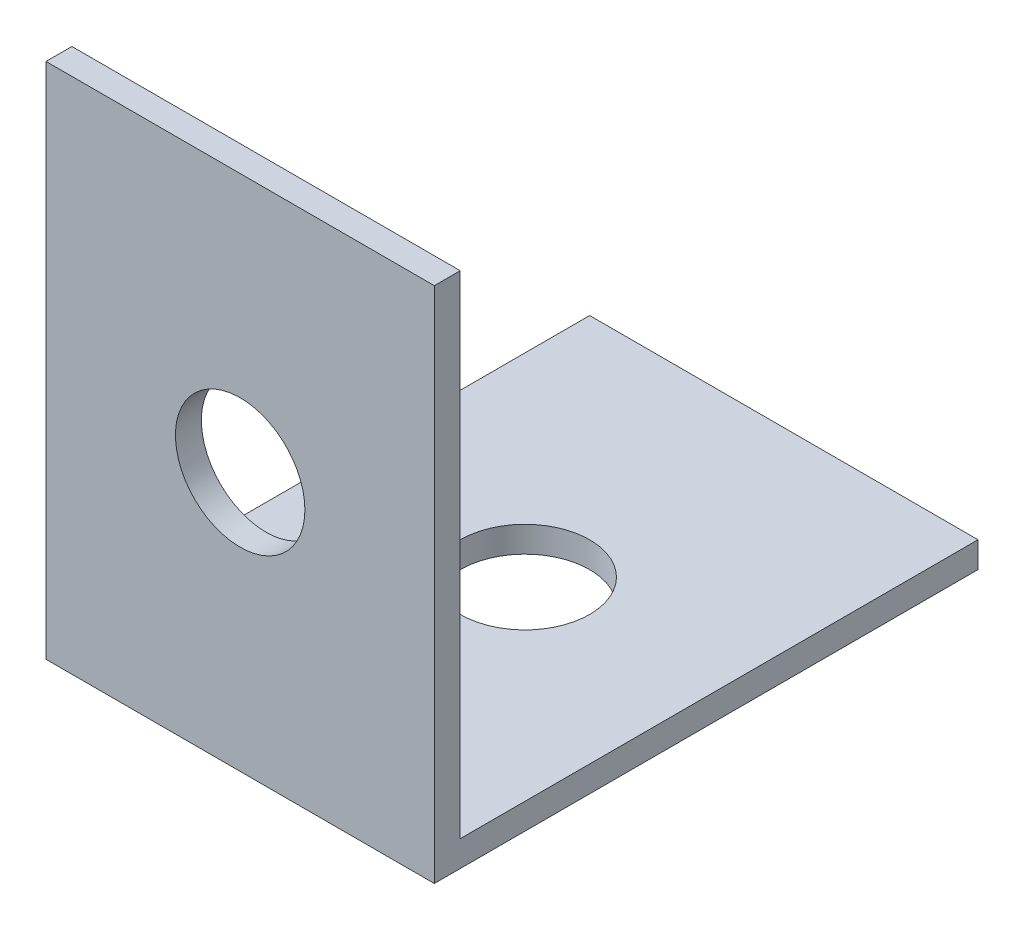
ISO-10303-21;
HEADER;
FILE_DESCRIPTION(('STEP AP214'),'2;1');
FILE_NAME('part.step','',(''),(''),'','','');
FILE_SCHEMA(('AUTOMOTIVE_DESIGN { 1 0 10303 214 1 1 1 1 }'));
ENDSEC;
DATA;
#1=APPLICATION_CONTEXT('core data for automotive mechanical design processes');
#2=APPLICATION_PROTOCOL_DEFINITION('international standard','automotive_design',2000,#1);
#3=PRODUCT_CONTEXT('',#1,'mechanical');
#4=PRODUCT('Part','Part','',(#3));
#5=PRODUCT_RELATED_PRODUCT_CATEGORY('part','',(#4));
#6=PRODUCT_DEFINITION_FORMATION('','',#4);
#7=PRODUCT_DEFINITION_CONTEXT('part definition',#1,'design');
#8=PRODUCT_DEFINITION('design','',#6,#7);
#9=PRODUCT_DEFINITION_SHAPE('','',#8);
#10=(LENGTH_UNIT() NAMED_UNIT(*) SI_UNIT(.MILLI.,.METRE.));
#11=(NAMED_UNIT(*) PLANE_ANGLE_UNIT() SI_UNIT($,.RADIAN.));
#12=(NAMED_UNIT(*) SI_UNIT($,.STERADIAN.) SOLID_ANGLE_UNIT());
#13=UNCERTAINTY_MEASURE_WITH_UNIT(LENGTH_MEASURE(1.E-05),#10,'distance_accuracy_value','');
#14=(GEOMETRIC_REPRESENTATION_CONTEXT(3) GLOBAL_UNCERTAINTY_ASSIGNED_CONTEXT((#13)) GLOBAL_UNIT_ASSIGNED_CONTEXT((#10,
#11,#12)) REPRESENTATION_CONTEXT('',''));
#15=CARTESIAN_POINT('',(0.,0.,0.));
#16=DIRECTION('',(0.,0.,1.));
#17=DIRECTION('',(1.,0.,0.));
#18=AXIS2_PLACEMENT_3D('',#15,#16,#17);
#19=CARTESIAN_POINT('',(0.,1.,0.));
#20=DIRECTION('',(0.,-1.,0.));
#21=DIRECTION('',(0.,0.,-1.));
#22=AXIS2_PLACEMENT_3D('',#19,#20,#21);
#23=PLANE('',#22);
#24=DIRECTION('',(0.,0.,-1.));
#25=VECTOR('',#24,1.);
#26=CARTESIAN_POINT('',(7.5,1.,10.));
#27=LINE('',#26,#25);
#28=CARTESIAN_POINT('',(7.5,1.,10.));
#29=VERTEX_POINT('',#28);
#30=CARTESIAN_POINT('',(7.5,1.,-10.));
#31=VERTEX_POINT('',#30);
#32=EDGE_CURVE('E88',#29,#31,#27,.T.);
#33=ORIENTED_EDGE('',*,*,#32,.T.);
#34=DIRECTION('',(-1.,0.,0.));
#35=VECTOR('',#34,1.);
#36=CARTESIAN_POINT('',(-7.5,1.,-10.));
#37=LINE('',#36,#35);
#38=CARTESIAN_POINT('',(-7.5,1.,-10.));
#39=VERTEX_POINT('',#38);
#40=EDGE_CURVE('E78',#31,#39,#37,.T.);
#41=ORIENTED_EDGE('',*,*,#40,.T.);
#42=DIRECTION('',(0.,0.,1.));
#43=VECTOR('',#42,1.);
#44=CARTESIAN_POINT('',(-7.5,1.,10.));
#45=LINE('',#44,#43);
#46=CARTESIAN_POINT('',(-7.5,1.,10.));
#47=VERTEX_POINT('',#46);
#48=EDGE_CURVE('E87',#39,#47,#45,.T.);
#49=ORIENTED_EDGE('',*,*,#48,.T.);
#50=DIRECTION('',(1.,0.,0.));
#51=VECTOR('',#50,1.);
#52=CARTESIAN_POINT('',(-7.5,1.,10.));
#53=LINE('',#52,#51);
#54=EDGE_CURVE('E67',#47,#29,#53,.T.);
#55=ORIENTED_EDGE('',*,*,#54,.T.);
#56=EDGE_LOOP('',(#33,#41,#49,#55));
#57=FACE_BOUND('',#56,.T.);
#58=CARTESIAN_POINT('',(0.,1.,0.));
#59=DIRECTION('',(0.,1.,0.));
#60=DIRECTION('',(0.,0.,1.));
#61=AXIS2_PLACEMENT_3D('',#58,#59,#60);
#62=CIRCLE('',#61,2.5);
#63=CARTESIAN_POINT('',(0.,1.,2.5));
#64=VERTEX_POINT('',#63);
#65=EDGE_CURVE('E103',#64,#64,#62,.T.);
#66=ORIENTED_EDGE('',*,*,#65,.F.);
#67=EDGE_LOOP('',(#66));
#68=FACE_BOUND('',#67,.T.);
#69=ADVANCED_FACE('F33',(#57,#68),#23,.F.);
#70=CARTESIAN_POINT('',(0.,0.,0.));
#71=DIRECTION('',(0.,-1.,0.));
#72=DIRECTION('',(0.,0.,-1.));
#73=AXIS2_PLACEMENT_3D('',#70,#71,#72);
#74=PLANE('',#73);
#75=DIRECTION('',(0.,0.,-1.));
#76=VECTOR('',#75,1.);
#77=CARTESIAN_POINT('',(7.5,0.,10.));
#78=LINE('',#77,#76);
#79=CARTESIAN_POINT('',(7.5,0.,11.));
#80=VERTEX_POINT('',#79);
#81=CARTESIAN_POINT('',(7.5,0.,-10.));
#82=VERTEX_POINT('',#81);
#83=EDGE_CURVE('E96',#80,#82,#78,.T.);
#84=ORIENTED_EDGE('',*,*,#83,.F.);
#85=DIRECTION('',(1.,0.,0.));
#86=VECTOR('',#85,1.);
#87=CARTESIAN_POINT('',(-7.5,0.,11.));
#88=LINE('',#87,#86);
#89=CARTESIAN_POINT('',(-7.5,0.,11.));
#90=VERTEX_POINT('',#89);
#91=EDGE_CURVE('E134',#90,#80,#88,.T.);
#92=ORIENTED_EDGE('',*,*,#91,.F.);
#93=DIRECTION('',(0.,0.,1.));
#94=VECTOR('',#93,1.);
#95=CARTESIAN_POINT('',(-7.5,0.,10.));
#96=LINE('',#95,#94);
#97=CARTESIAN_POINT('',(-7.5,0.,-10.));
#98=VERTEX_POINT('',#97);
#99=EDGE_CURVE('E93',#98,#90,#96,.T.);
#100=ORIENTED_EDGE('',*,*,#99,.F.);
#101=DIRECTION('',(-1.,0.,0.));
#102=VECTOR('',#101,1.);
#103=CARTESIAN_POINT('',(-7.5,0.,-10.));
#104=LINE('',#103,#102);
#105=EDGE_CURVE('E63',#82,#98,#104,.T.);
#106=ORIENTED_EDGE('',*,*,#105,.F.);
#107=EDGE_LOOP('',(#84,#92,#100,#106));
#108=FACE_BOUND('',#107,.T.);
#109=CARTESIAN_POINT('',(0.,0.,0.));
#110=DIRECTION('',(0.,1.,0.));
#111=DIRECTION('',(0.,0.,1.));
#112=AXIS2_PLACEMENT_3D('',#109,#110,#111);
#113=CIRCLE('',#112,2.5);
#114=CARTESIAN_POINT('',(0.,0.,2.5));
#115=VERTEX_POINT('',#114);
#116=EDGE_CURVE('E107',#115,#115,#113,.T.);
#117=ORIENTED_EDGE('',*,*,#116,.T.);
#118=EDGE_LOOP('',(#117));
#119=FACE_BOUND('',#118,.T.);
#120=ADVANCED_FACE('F164',(#108,#119),#74,.T.);
#121=CARTESIAN_POINT('',(7.5,1.,10.));
#122=DIRECTION('',(-1.,0.,0.));
#123=DIRECTION('',(0.,0.,1.));
#124=AXIS2_PLACEMENT_3D('',#121,#122,#123);
#125=PLANE('',#124);
#126=ORIENTED_EDGE('',*,*,#83,.T.);
#127=DIRECTION('',(0.,-1.,0.));
#128=VECTOR('',#127,1.);
#129=CARTESIAN_POINT('',(7.5,1.,-10.));
#130=LINE('',#129,#128);
#131=EDGE_CURVE('E11',#31,#82,#130,.T.);
#132=ORIENTED_EDGE('',*,*,#131,.F.);
#133=ORIENTED_EDGE('',*,*,#32,.F.);
#134=DIRECTION('',(0.,1.,0.));
#135=VECTOR('',#134,1.);
#136=CARTESIAN_POINT('',(7.5,0.,10.));
#137=LINE('',#136,#135);
#138=CARTESIAN_POINT('',(7.5,20.,10.));
#139=VERTEX_POINT('',#138);
#140=EDGE_CURVE('E50',#29,#139,#137,.T.);
#141=ORIENTED_EDGE('',*,*,#140,.T.);
#142=DIRECTION('',(0.,0.,-1.));
#143=VECTOR('',#142,1.);
#144=CARTESIAN_POINT('',(7.5,20.,11.));
#145=LINE('',#144,#143);
#146=CARTESIAN_POINT('',(7.5,20.,11.));
#147=VERTEX_POINT('',#146);
#148=EDGE_CURVE('E116',#147,#139,#145,.T.);
#149=ORIENTED_EDGE('',*,*,#148,.F.);
#150=DIRECTION('',(0.,1.,0.));
#151=VECTOR('',#150,1.);
#152=CARTESIAN_POINT('',(7.5,0.,11.));
#153=LINE('',#152,#151);
#154=EDGE_CURVE('E100',#80,#147,#153,.T.);
#155=ORIENTED_EDGE('',*,*,#154,.F.);
#156=EDGE_LOOP('',(#126,#132,#133,#141,#149,#155));
#157=FACE_BOUND('',#156,.T.);
#158=ADVANCED_FACE('F35',(#157),#125,.F.);
#159=CARTESIAN_POINT('',(-7.5,1.,-10.));
#160=DIRECTION('',(0.,0.,1.));
#161=DIRECTION('',(1.,0.,0.));
#162=AXIS2_PLACEMENT_3D('',#159,#160,#161);
#163=PLANE('',#162);
#164=ORIENTED_EDGE('',*,*,#105,.T.);
#165=DIRECTION('',(0.,-1.,0.));
#166=VECTOR('',#165,1.);
#167=CARTESIAN_POINT('',(-7.5,1.,-10.));
#168=LINE('',#167,#166);
#169=EDGE_CURVE('E42',#39,#98,#168,.T.);
#170=ORIENTED_EDGE('',*,*,#169,.F.);
#171=ORIENTED_EDGE('',*,*,#40,.F.);
#172=ORIENTED_EDGE('',*,*,#131,.T.);
#173=EDGE_LOOP('',(#164,#170,#171,#172));
#174=FACE_BOUND('',#173,.T.);
#175=ADVANCED_FACE('F80',(#174),#163,.F.);
#176=CARTESIAN_POINT('',(-7.5,1.,10.));
#177=DIRECTION('',(1.,0.,0.));
#178=DIRECTION('',(0.,0.,-1.));
#179=AXIS2_PLACEMENT_3D('',#176,#177,#178);
#180=PLANE('',#179);
#181=ORIENTED_EDGE('',*,*,#99,.T.);
#182=DIRECTION('',(0.,-1.,0.));
#183=VECTOR('',#182,1.);
#184=CARTESIAN_POINT('',(-7.5,0.,11.));
#185=LINE('',#184,#183);
#186=CARTESIAN_POINT('',(-7.5,20.,11.));
#187=VERTEX_POINT('',#186);
#188=EDGE_CURVE('E127',#187,#90,#185,.T.);
#189=ORIENTED_EDGE('',*,*,#188,.F.);
#190=DIRECTION('',(0.,0.,-1.));
#191=VECTOR('',#190,1.);
#192=CARTESIAN_POINT('',(-7.5,20.,11.));
#193=LINE('',#192,#191);
#194=CARTESIAN_POINT('',(-7.5,20.,10.));
#195=VERTEX_POINT('',#194);
#196=EDGE_CURVE('E120',#187,#195,#193,.T.);
#197=ORIENTED_EDGE('',*,*,#196,.T.);
#198=DIRECTION('',(0.,-1.,0.));
#199=VECTOR('',#198,1.);
#200=CARTESIAN_POINT('',(-7.5,0.,10.));
#201=LINE('',#200,#199);
#202=EDGE_CURVE('E129',#195,#47,#201,.T.);
#203=ORIENTED_EDGE('',*,*,#202,.T.);
#204=ORIENTED_EDGE('',*,*,#48,.F.);
#205=ORIENTED_EDGE('',*,*,#169,.T.);
#206=EDGE_LOOP('',(#181,#189,#197,#203,#204,#205));
#207=FACE_BOUND('',#206,.T.);
#208=ADVANCED_FACE('F172',(#207),#180,.F.);
#209=CARTESIAN_POINT('',(0.,1.,0.));
#210=DIRECTION('',(0.,-1.,0.));
#211=DIRECTION('',(0.,0.,-1.));
#212=AXIS2_PLACEMENT_3D('',#209,#210,#211);
#213=CYLINDRICAL_SURFACE('',#212,2.5);
#214=ORIENTED_EDGE('',*,*,#65,.T.);
#215=EDGE_LOOP('',(#214));
#216=FACE_BOUND('',#215,.T.);
#217=ORIENTED_EDGE('',*,*,#116,.F.);
#218=EDGE_LOOP('',(#217));
#219=FACE_BOUND('',#218,.T.);
#220=ADVANCED_FACE('F159',(#216,#219),#213,.F.);
#221=CARTESIAN_POINT('',(0.,0.,10.));
#222=DIRECTION('',(0.,0.,-1.));
#223=DIRECTION('',(-1.,0.,0.));
#224=AXIS2_PLACEMENT_3D('',#221,#222,#223);
#225=PLANE('',#224);
#226=CARTESIAN_POINT('',(0.,10.,10.));
#227=DIRECTION('',(0.,0.,1.));
#228=DIRECTION('',(1.,0.,0.));
#229=AXIS2_PLACEMENT_3D('',#226,#227,#228);
#230=CIRCLE('',#229,2.5);
#231=CARTESIAN_POINT('',(2.5,10.,10.));
#232=VERTEX_POINT('',#231);
#233=EDGE_CURVE('E138',#232,#232,#230,.T.);
#234=ORIENTED_EDGE('',*,*,#233,.T.);
#235=EDGE_LOOP('',(#234));
#236=FACE_BOUND('',#235,.T.);
#237=ORIENTED_EDGE('',*,*,#54,.F.);
#238=ORIENTED_EDGE('',*,*,#202,.F.);
#239=DIRECTION('',(-1.,0.,0.));
#240=VECTOR('',#239,1.);
#241=CARTESIAN_POINT('',(-7.5,20.,10.));
#242=LINE('',#241,#240);
#243=EDGE_CURVE('E124',#139,#195,#242,.T.);
#244=ORIENTED_EDGE('',*,*,#243,.F.);
#245=ORIENTED_EDGE('',*,*,#140,.F.);
#246=EDGE_LOOP('',(#237,#238,#244,#245));
#247=FACE_BOUND('',#246,.T.);
#248=ADVANCED_FACE('F150',(#236,#247),#225,.T.);
#249=CARTESIAN_POINT('',(0.,0.,11.));
#250=DIRECTION('',(0.,0.,-1.));
#251=DIRECTION('',(-1.,0.,0.));
#252=AXIS2_PLACEMENT_3D('',#249,#250,#251);
#253=PLANE('',#252);
#254=ORIENTED_EDGE('',*,*,#188,.T.);
#255=ORIENTED_EDGE('',*,*,#91,.T.);
#256=ORIENTED_EDGE('',*,*,#154,.T.);
#257=DIRECTION('',(-1.,0.,0.));
#258=VECTOR('',#257,1.);
#259=CARTESIAN_POINT('',(-7.5,20.,11.));
#260=LINE('',#259,#258);
#261=EDGE_CURVE('E123',#147,#187,#260,.T.);
#262=ORIENTED_EDGE('',*,*,#261,.T.);
#263=EDGE_LOOP('',(#254,#255,#256,#262));
#264=FACE_BOUND('',#263,.T.);
#265=CARTESIAN_POINT('',(0.,10.,11.));
#266=DIRECTION('',(0.,0.,1.));
#267=DIRECTION('',(1.,0.,0.));
#268=AXIS2_PLACEMENT_3D('',#265,#266,#267);
#269=CIRCLE('',#268,2.5);
#270=CARTESIAN_POINT('',(2.5,10.,11.));
#271=VERTEX_POINT('',#270);
#272=EDGE_CURVE('E131',#271,#271,#269,.T.);
#273=ORIENTED_EDGE('',*,*,#272,.F.);
#274=EDGE_LOOP('',(#273));
#275=FACE_BOUND('',#274,.T.);
#276=ADVANCED_FACE('F147',(#264,#275),#253,.F.);
#277=CARTESIAN_POINT('',(-7.5,20.,11.));
#278=DIRECTION('',(0.,-1.,0.));
#279=DIRECTION('',(0.,0.,-1.));
#280=AXIS2_PLACEMENT_3D('',#277,#278,#279);
#281=PLANE('',#280);
#282=ORIENTED_EDGE('',*,*,#243,.T.);
#283=ORIENTED_EDGE('',*,*,#196,.F.);
#284=ORIENTED_EDGE('',*,*,#261,.F.);
#285=ORIENTED_EDGE('',*,*,#148,.T.);
#286=EDGE_LOOP('',(#282,#283,#284,#285));
#287=FACE_BOUND('',#286,.T.);
#288=ADVANCED_FACE('F149',(#287),#281,.F.);
#289=CARTESIAN_POINT('',(0.,10.,11.));
#290=DIRECTION('',(0.,0.,-1.));
#291=DIRECTION('',(-1.,0.,0.));
#292=AXIS2_PLACEMENT_3D('',#289,#290,#291);
#293=CYLINDRICAL_SURFACE('',#292,2.5);
#294=ORIENTED_EDGE('',*,*,#272,.T.);
#295=EDGE_LOOP('',(#294));
#296=FACE_BOUND('',#295,.T.);
#297=ORIENTED_EDGE('',*,*,#233,.F.);
#298=EDGE_LOOP('',(#297));
#299=FACE_BOUND('',#298,.T.);
#300=ADVANCED_FACE('F144',(#296,#299),#293,.F.);
#301=CLOSED_SHELL('',(#69,#120,#158,#175,#208,#220,#248,#276,#288,#300));
#302=MANIFOLD_SOLID_BREP('B2',#301);
#303=ADVANCED_BREP_SHAPE_REPRESENTATION('',(#18,#302),#14);
#304=SHAPE_DEFINITION_REPRESENTATION(#9,#303);
ENDSEC;
END-ISO-10303-21;
